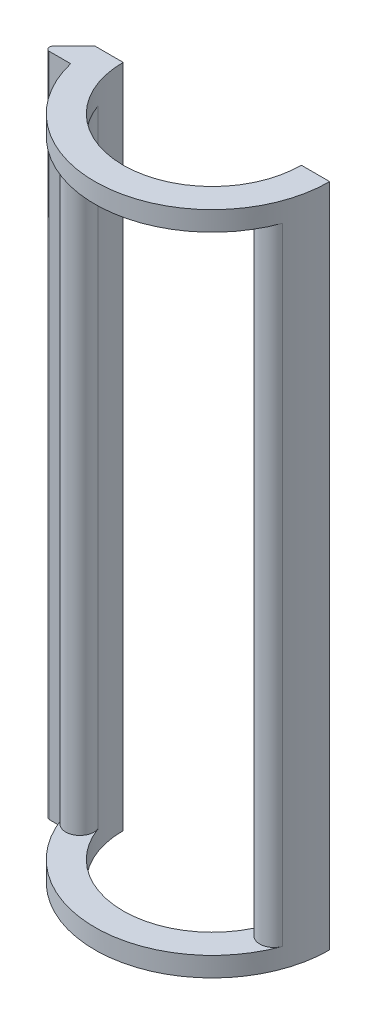
ISO-10303-21;
HEADER;
FILE_DESCRIPTION(('STEP AP214'),'2;1');
FILE_NAME('part.step','',(''),(''),'','','');
FILE_SCHEMA(('AUTOMOTIVE_DESIGN { 1 0 10303 214 1 1 1 1 }'));
ENDSEC;
DATA;
#1=APPLICATION_CONTEXT('core data for automotive mechanical design processes');
#2=APPLICATION_PROTOCOL_DEFINITION('international standard','automotive_design',2000,#1);
#3=PRODUCT_CONTEXT('',#1,'mechanical');
#4=PRODUCT('Part','Part','',(#3));
#5=PRODUCT_RELATED_PRODUCT_CATEGORY('part','',(#4));
#6=PRODUCT_DEFINITION_FORMATION('','',#4);
#7=PRODUCT_DEFINITION_CONTEXT('part definition',#1,'design');
#8=PRODUCT_DEFINITION('design','',#6,#7);
#9=PRODUCT_DEFINITION_SHAPE('','',#8);
#10=(LENGTH_UNIT() NAMED_UNIT(*) SI_UNIT(.MILLI.,.METRE.));
#11=(NAMED_UNIT(*) PLANE_ANGLE_UNIT() SI_UNIT($,.RADIAN.));
#12=(NAMED_UNIT(*) SI_UNIT($,.STERADIAN.) SOLID_ANGLE_UNIT());
#13=UNCERTAINTY_MEASURE_WITH_UNIT(LENGTH_MEASURE(1.E-05),#10,'distance_accuracy_value','');
#14=(GEOMETRIC_REPRESENTATION_CONTEXT(3) GLOBAL_UNCERTAINTY_ASSIGNED_CONTEXT((#13)) GLOBAL_UNIT_ASSIGNED_CONTEXT((#10,
#11,#12)) REPRESENTATION_CONTEXT('',''));
#15=CARTESIAN_POINT('',(0.,0.,0.));
#16=DIRECTION('',(0.,0.,1.));
#17=DIRECTION('',(1.,0.,0.));
#18=AXIS2_PLACEMENT_3D('',#15,#16,#17);
#19=CARTESIAN_POINT('',(0.,215.9,0.));
#20=DIRECTION('',(0.,-1.,0.));
#21=DIRECTION('',(0.,0.,-1.));
#22=AXIS2_PLACEMENT_3D('',#19,#20,#21);
#23=CYLINDRICAL_SURFACE('',#22,28.9052);
#24=DIRECTION('',(0.,-1.,0.));
#25=VECTOR('',#24,1.);
#26=CARTESIAN_POINT('',(27.1620031423408,209.55,9.88616064685723));
#27=LINE('',#26,#25);
#28=CARTESIAN_POINT('',(27.1620031423408,209.55,9.88616064685723));
#29=VERTEX_POINT('',#28);
#30=CARTESIAN_POINT('',(27.1620031423408,6.34999999999999,9.88616064685723));
#31=VERTEX_POINT('',#30);
#32=EDGE_CURVE('E54',#29,#31,#27,.T.);
#33=ORIENTED_EDGE('',*,*,#32,.F.);
#34=CARTESIAN_POINT('',(0.,209.55,0.));
#35=DIRECTION('',(0.,-1.,0.));
#36=DIRECTION('',(0.,0.,-1.));
#37=AXIS2_PLACEMENT_3D('',#34,#35,#36);
#38=CIRCLE('',#37,28.9052);
#39=CARTESIAN_POINT('',(-27.1620031423408,209.55,9.88616064685723));
#40=VERTEX_POINT('',#39);
#41=EDGE_CURVE('E344',#29,#40,#38,.T.);
#42=ORIENTED_EDGE('',*,*,#41,.T.);
#43=DIRECTION('',(0.,-1.,0.));
#44=VECTOR('',#43,1.);
#45=CARTESIAN_POINT('',(-27.1620031423408,209.55,9.88616064685723));
#46=LINE('',#45,#44);
#47=CARTESIAN_POINT('',(-27.1620031423408,6.35,9.88616064685723));
#48=VERTEX_POINT('',#47);
#49=EDGE_CURVE('E139',#40,#48,#46,.T.);
#50=ORIENTED_EDGE('',*,*,#49,.T.);
#51=CARTESIAN_POINT('',(0.,6.35,0.));
#52=DIRECTION('',(0.,-1.,0.));
#53=DIRECTION('',(0.,0.,-1.));
#54=AXIS2_PLACEMENT_3D('',#51,#52,#53);
#55=CIRCLE('',#54,28.9052);
#56=EDGE_CURVE('E140',#31,#48,#55,.T.);
#57=ORIENTED_EDGE('',*,*,#56,.F.);
#58=EDGE_LOOP('',(#33,#42,#50,#57));
#59=FACE_BOUND('',#58,.T.);
#60=CARTESIAN_POINT('',(0.,0.,0.));
#61=DIRECTION('',(0.,-1.,0.));
#62=DIRECTION('',(0.,0.,1.));
#63=AXIS2_PLACEMENT_3D('',#60,#61,#62);
#64=CIRCLE('',#63,28.9052);
#65=CARTESIAN_POINT('',(28.9052,0.,0.));
#66=VERTEX_POINT('',#65);
#67=CARTESIAN_POINT('',(-28.9052,0.,0.));
#68=VERTEX_POINT('',#67);
#69=EDGE_CURVE('E145',#66,#68,#64,.T.);
#70=ORIENTED_EDGE('',*,*,#69,.T.);
#71=DIRECTION('',(0.,-1.,0.));
#72=VECTOR('',#71,1.);
#73=CARTESIAN_POINT('',(-28.9052,215.9,0.));
#74=LINE('',#73,#72);
#75=CARTESIAN_POINT('',(-28.9052,215.9,0.));
#76=VERTEX_POINT('',#75);
#77=EDGE_CURVE('E190',#76,#68,#74,.T.);
#78=ORIENTED_EDGE('',*,*,#77,.F.);
#79=CARTESIAN_POINT('',(0.,215.9,0.));
#80=DIRECTION('',(0.,-1.,0.));
#81=DIRECTION('',(0.,0.,1.));
#82=AXIS2_PLACEMENT_3D('',#79,#80,#81);
#83=CIRCLE('',#82,28.9052);
#84=CARTESIAN_POINT('',(28.9052,215.9,0.));
#85=VERTEX_POINT('',#84);
#86=EDGE_CURVE('E154',#85,#76,#83,.T.);
#87=ORIENTED_EDGE('',*,*,#86,.F.);
#88=DIRECTION('',(0.,-1.,0.));
#89=VECTOR('',#88,1.);
#90=CARTESIAN_POINT('',(28.9052,215.9,0.));
#91=LINE('',#90,#89);
#92=EDGE_CURVE('E168',#85,#66,#91,.T.);
#93=ORIENTED_EDGE('',*,*,#92,.T.);
#94=EDGE_LOOP('',(#70,#78,#87,#93));
#95=FACE_BOUND('',#94,.T.);
#96=ADVANCED_FACE('F39',(#59,#95),#23,.F.);
#97=CARTESIAN_POINT('',(-28.9052,215.9,0.));
#98=DIRECTION('',(0.,0.,1.));
#99=DIRECTION('',(1.,0.,0.));
#100=AXIS2_PLACEMENT_3D('',#97,#98,#99);
#101=PLANE('',#100);
#102=DIRECTION('',(-1.,0.,0.));
#103=VECTOR('',#102,1.);
#104=CARTESIAN_POINT('',(-28.9052,0.,0.));
#105=LINE('',#104,#103);
#106=CARTESIAN_POINT('',(-38.1,0.,0.));
#107=VERTEX_POINT('',#106);
#108=EDGE_CURVE('E149',#68,#107,#105,.T.);
#109=ORIENTED_EDGE('',*,*,#108,.T.);
#110=DIRECTION('',(0.,-1.,0.));
#111=VECTOR('',#110,1.);
#112=CARTESIAN_POINT('',(-38.1,215.9,0.));
#113=LINE('',#112,#111);
#114=CARTESIAN_POINT('',(-38.1,215.9,0.));
#115=VERTEX_POINT('',#114);
#116=EDGE_CURVE('E187',#115,#107,#113,.T.);
#117=ORIENTED_EDGE('',*,*,#116,.F.);
#118=DIRECTION('',(-1.,0.,0.));
#119=VECTOR('',#118,1.);
#120=CARTESIAN_POINT('',(-28.9052,215.9,0.));
#121=LINE('',#120,#119);
#122=EDGE_CURVE('E157',#76,#115,#121,.T.);
#123=ORIENTED_EDGE('',*,*,#122,.F.);
#124=ORIENTED_EDGE('',*,*,#77,.T.);
#125=EDGE_LOOP('',(#109,#117,#123,#124));
#126=FACE_BOUND('',#125,.T.);
#127=ADVANCED_FACE('F228',(#126),#101,.F.);
#128=CARTESIAN_POINT('',(-46.99,215.9,8.89));
#129=DIRECTION('',(0.707106781186547,0.,0.707106781186548));
#130=DIRECTION('',(0.707106781186548,0.,-0.707106781186547));
#131=AXIS2_PLACEMENT_3D('',#128,#129,#130);
#132=PLANE('',#131);
#133=DIRECTION('',(-0.707106781186548,0.,0.707106781186547));
#134=VECTOR('',#133,1.);
#135=CARTESIAN_POINT('',(-46.99,0.,8.89));
#136=LINE('',#135,#134);
#137=CARTESIAN_POINT('',(-44.8219743878931,0.,6.72197438789308));
#138=VERTEX_POINT('',#137);
#139=EDGE_CURVE('E171',#107,#138,#136,.T.);
#140=ORIENTED_EDGE('',*,*,#139,.T.);
#141=DIRECTION('',(0.,-1.,0.));
#142=VECTOR('',#141,1.);
#143=CARTESIAN_POINT('',(-44.8219743878931,215.9,6.72197438789308));
#144=LINE('',#143,#142);
#145=CARTESIAN_POINT('',(-44.8219743878931,215.9,6.72197438789308));
#146=VERTEX_POINT('',#145);
#147=EDGE_CURVE('E47',#138,#146,#144,.F.);
#148=ORIENTED_EDGE('',*,*,#147,.T.);
#149=DIRECTION('',(-0.707106781186548,0.,0.707106781186547));
#150=VECTOR('',#149,1.);
#151=CARTESIAN_POINT('',(-46.99,215.9,8.89));
#152=LINE('',#151,#150);
#153=EDGE_CURVE('E160',#115,#146,#152,.T.);
#154=ORIENTED_EDGE('',*,*,#153,.F.);
#155=ORIENTED_EDGE('',*,*,#116,.T.);
#156=EDGE_LOOP('',(#140,#148,#154,#155));
#157=FACE_BOUND('',#156,.T.);
#158=ADVANCED_FACE('F200',(#157),#132,.F.);
#159=CARTESIAN_POINT('',(-38.1,215.9,8.89));
#160=DIRECTION('',(0.,0.,-1.));
#161=DIRECTION('',(-1.,0.,0.));
#162=AXIS2_PLACEMENT_3D('',#159,#160,#161);
#163=PLANE('',#162);
#164=DIRECTION('',(1.,0.,0.));
#165=VECTOR('',#164,1.);
#166=CARTESIAN_POINT('',(-38.1,215.9,8.89));
#167=LINE('',#166,#165);
#168=CARTESIAN_POINT('',(-43.9239487757862,215.9,8.89));
#169=VERTEX_POINT('',#168);
#170=CARTESIAN_POINT('',(-37.0483184503697,215.9,8.89));
#171=VERTEX_POINT('',#170);
#172=EDGE_CURVE('E163',#169,#171,#167,.T.);
#173=ORIENTED_EDGE('',*,*,#172,.F.);
#174=DIRECTION('',(0.,-1.,0.));
#175=VECTOR('',#174,1.);
#176=CARTESIAN_POINT('',(-43.9239487757862,215.9,8.89));
#177=LINE('',#176,#175);
#178=CARTESIAN_POINT('',(-43.9239487757862,0.,8.89));
#179=VERTEX_POINT('',#178);
#180=EDGE_CURVE('E193',#169,#179,#177,.T.);
#181=ORIENTED_EDGE('',*,*,#180,.T.);
#182=DIRECTION('',(1.,0.,0.));
#183=VECTOR('',#182,1.);
#184=CARTESIAN_POINT('',(-38.1,0.,8.89));
#185=LINE('',#184,#183);
#186=CARTESIAN_POINT('',(-37.0483184503697,0.,8.89));
#187=VERTEX_POINT('',#186);
#188=EDGE_CURVE('E174',#179,#187,#185,.T.);
#189=ORIENTED_EDGE('',*,*,#188,.T.);
#190=DIRECTION('',(0.,-1.,0.));
#191=VECTOR('',#190,1.);
#192=CARTESIAN_POINT('',(-37.0483184503697,215.9,8.89));
#193=LINE('',#192,#191);
#194=EDGE_CURVE('E184',#171,#187,#193,.T.);
#195=ORIENTED_EDGE('',*,*,#194,.F.);
#196=EDGE_LOOP('',(#173,#181,#189,#195));
#197=FACE_BOUND('',#196,.T.);
#198=ADVANCED_FACE('F211',(#197),#163,.F.);
#199=CARTESIAN_POINT('',(0.,215.9,0.));
#200=DIRECTION('',(0.,-1.,0.));
#201=DIRECTION('',(0.,0.,-1.));
#202=AXIS2_PLACEMENT_3D('',#199,#200,#201);
#203=CYLINDRICAL_SURFACE('',#202,38.1);
#204=DIRECTION('',(0.,-1.,0.));
#205=VECTOR('',#204,1.);
#206=CARTESIAN_POINT('',(-35.8022888519431,209.55,13.0309674607081));
#207=LINE('',#206,#205);
#208=CARTESIAN_POINT('',(-35.8022888519431,209.55,13.0309674607081));
#209=VERTEX_POINT('',#208);
#210=CARTESIAN_POINT('',(-35.8022888519431,6.35,13.0309674607081));
#211=VERTEX_POINT('',#210);
#212=EDGE_CURVE('E136',#209,#211,#207,.T.);
#213=ORIENTED_EDGE('',*,*,#212,.F.);
#214=CARTESIAN_POINT('',(0.,209.55,0.));
#215=DIRECTION('',(0.,1.,0.));
#216=DIRECTION('',(0.,0.,1.));
#217=AXIS2_PLACEMENT_3D('',#214,#215,#216);
#218=CIRCLE('',#217,38.1);
#219=CARTESIAN_POINT('',(35.8022888519431,209.55,13.0309674607081));
#220=VERTEX_POINT('',#219);
#221=EDGE_CURVE('E123',#209,#220,#218,.T.);
#222=ORIENTED_EDGE('',*,*,#221,.T.);
#223=DIRECTION('',(0.,-1.,0.));
#224=VECTOR('',#223,1.);
#225=CARTESIAN_POINT('',(35.8022888519431,209.55,13.0309674607081));
#226=LINE('',#225,#224);
#227=CARTESIAN_POINT('',(35.8022888519431,6.35,13.0309674607081));
#228=VERTEX_POINT('',#227);
#229=EDGE_CURVE('E146',#220,#228,#226,.T.);
#230=ORIENTED_EDGE('',*,*,#229,.T.);
#231=CARTESIAN_POINT('',(0.,6.35,0.));
#232=DIRECTION('',(0.,1.,0.));
#233=DIRECTION('',(0.,0.,1.));
#234=AXIS2_PLACEMENT_3D('',#231,#232,#233);
#235=CIRCLE('',#234,38.1);
#236=EDGE_CURVE('E144',#211,#228,#235,.T.);
#237=ORIENTED_EDGE('',*,*,#236,.F.);
#238=EDGE_LOOP('',(#213,#222,#230,#237));
#239=FACE_BOUND('',#238,.T.);
#240=CARTESIAN_POINT('',(0.,0.,0.));
#241=DIRECTION('',(0.,1.,0.));
#242=DIRECTION('',(0.,0.,-1.));
#243=AXIS2_PLACEMENT_3D('',#240,#241,#242);
#244=CIRCLE('',#243,38.1);
#245=CARTESIAN_POINT('',(38.1,0.,0.));
#246=VERTEX_POINT('',#245);
#247=EDGE_CURVE('E176',#187,#246,#244,.T.);
#248=ORIENTED_EDGE('',*,*,#247,.T.);
#249=DIRECTION('',(0.,-1.,0.));
#250=VECTOR('',#249,1.);
#251=CARTESIAN_POINT('',(38.1,215.9,0.));
#252=LINE('',#251,#250);
#253=CARTESIAN_POINT('',(38.1,215.9,0.));
#254=VERTEX_POINT('',#253);
#255=EDGE_CURVE('E181',#254,#246,#252,.T.);
#256=ORIENTED_EDGE('',*,*,#255,.F.);
#257=CARTESIAN_POINT('',(0.,215.9,0.));
#258=DIRECTION('',(0.,1.,0.));
#259=DIRECTION('',(0.,0.,-1.));
#260=AXIS2_PLACEMENT_3D('',#257,#258,#259);
#261=CIRCLE('',#260,38.1);
#262=EDGE_CURVE('E165',#171,#254,#261,.T.);
#263=ORIENTED_EDGE('',*,*,#262,.F.);
#264=ORIENTED_EDGE('',*,*,#194,.T.);
#265=EDGE_LOOP('',(#248,#256,#263,#264));
#266=FACE_BOUND('',#265,.T.);
#267=ADVANCED_FACE('F142',(#239,#266),#203,.T.);
#268=CARTESIAN_POINT('',(28.9052,215.9,0.));
#269=DIRECTION('',(0.,0.,1.));
#270=DIRECTION('',(1.,0.,0.));
#271=AXIS2_PLACEMENT_3D('',#268,#269,#270);
#272=PLANE('',#271);
#273=DIRECTION('',(-1.,0.,0.));
#274=VECTOR('',#273,1.);
#275=CARTESIAN_POINT('',(28.9052,0.,0.));
#276=LINE('',#275,#274);
#277=EDGE_CURVE('E158',#246,#66,#276,.T.);
#278=ORIENTED_EDGE('',*,*,#277,.T.);
#279=ORIENTED_EDGE('',*,*,#92,.F.);
#280=DIRECTION('',(-1.,0.,0.));
#281=VECTOR('',#280,1.);
#282=CARTESIAN_POINT('',(28.9052,215.9,0.));
#283=LINE('',#282,#281);
#284=EDGE_CURVE('E167',#254,#85,#283,.T.);
#285=ORIENTED_EDGE('',*,*,#284,.F.);
#286=ORIENTED_EDGE('',*,*,#255,.T.);
#287=EDGE_LOOP('',(#278,#279,#285,#286));
#288=FACE_BOUND('',#287,.T.);
#289=ADVANCED_FACE('F222',(#288),#272,.F.);
#290=CARTESIAN_POINT('',(0.,215.9,0.));
#291=DIRECTION('',(0.,1.,0.));
#292=DIRECTION('',(0.,0.,1.));
#293=AXIS2_PLACEMENT_3D('',#290,#291,#292);
#294=PLANE('',#293);
#295=ORIENTED_EDGE('',*,*,#153,.T.);
#296=CARTESIAN_POINT('',(-43.9239487757862,215.9,7.62));
#297=DIRECTION('',(0.,1.,0.));
#298=DIRECTION('',(0.,0.,1.));
#299=AXIS2_PLACEMENT_3D('',#296,#297,#298);
#300=CIRCLE('',#299,1.27);
#301=EDGE_CURVE('E11',#146,#169,#300,.T.);
#302=ORIENTED_EDGE('',*,*,#301,.T.);
#303=ORIENTED_EDGE('',*,*,#172,.T.);
#304=ORIENTED_EDGE('',*,*,#262,.T.);
#305=ORIENTED_EDGE('',*,*,#284,.T.);
#306=ORIENTED_EDGE('',*,*,#86,.T.);
#307=ORIENTED_EDGE('',*,*,#122,.T.);
#308=EDGE_LOOP('',(#295,#302,#303,#304,#305,#306,#307));
#309=FACE_BOUND('',#308,.T.);
#310=ADVANCED_FACE('F205',(#309),#294,.T.);
#311=CARTESIAN_POINT('',(0.,0.,0.));
#312=DIRECTION('',(0.,1.,0.));
#313=DIRECTION('',(0.,0.,1.));
#314=AXIS2_PLACEMENT_3D('',#311,#312,#313);
#315=PLANE('',#314);
#316=ORIENTED_EDGE('',*,*,#188,.F.);
#317=CARTESIAN_POINT('',(-43.9239487757862,0.,7.62));
#318=DIRECTION('',(0.,1.,0.));
#319=DIRECTION('',(0.,0.,1.));
#320=AXIS2_PLACEMENT_3D('',#317,#318,#319);
#321=CIRCLE('',#320,1.27);
#322=EDGE_CURVE('E196',#179,#138,#321,.F.);
#323=ORIENTED_EDGE('',*,*,#322,.T.);
#324=ORIENTED_EDGE('',*,*,#139,.F.);
#325=ORIENTED_EDGE('',*,*,#108,.F.);
#326=ORIENTED_EDGE('',*,*,#69,.F.);
#327=ORIENTED_EDGE('',*,*,#277,.F.);
#328=ORIENTED_EDGE('',*,*,#247,.F.);
#329=EDGE_LOOP('',(#316,#323,#324,#325,#326,#327,#328));
#330=FACE_BOUND('',#329,.T.);
#331=ADVANCED_FACE('F215',(#330),#315,.F.);
#332=CARTESIAN_POINT('',(-43.9239487757862,215.9,7.62));
#333=DIRECTION('',(0.,-1.,0.));
#334=DIRECTION('',(0.,0.,-1.));
#335=AXIS2_PLACEMENT_3D('',#332,#333,#334);
#336=CYLINDRICAL_SURFACE('',#335,1.27);
#337=ORIENTED_EDGE('',*,*,#301,.F.);
#338=ORIENTED_EDGE('',*,*,#147,.F.);
#339=ORIENTED_EDGE('',*,*,#322,.F.);
#340=ORIENTED_EDGE('',*,*,#180,.F.);
#341=EDGE_LOOP('',(#337,#338,#339,#340));
#342=FACE_BOUND('',#341,.T.);
#343=ADVANCED_FACE('F41',(#342),#336,.T.);
#344=CARTESIAN_POINT('',(-31.4821459971419,209.55,11.4585640537827));
#345=DIRECTION('',(0.,-1.,0.));
#346=DIRECTION('',(0.,0.,-1.));
#347=AXIS2_PLACEMENT_3D('',#344,#345,#346);
#348=CYLINDRICAL_SURFACE('',#347,4.5974);
#349=CARTESIAN_POINT('',(-31.4821459971419,6.35,11.4585640537827));
#350=DIRECTION('',(0.,-1.,0.));
#351=DIRECTION('',(0.,0.,1.));
#352=AXIS2_PLACEMENT_3D('',#349,#350,#351);
#353=CIRCLE('',#352,4.5974);
#354=EDGE_CURVE('E62',#48,#211,#353,.T.);
#355=ORIENTED_EDGE('',*,*,#354,.F.);
#356=ORIENTED_EDGE('',*,*,#49,.F.);
#357=CARTESIAN_POINT('',(-31.4821459971419,209.55,11.4585640537827));
#358=DIRECTION('',(0.,-1.,0.));
#359=DIRECTION('',(0.,0.,1.));
#360=AXIS2_PLACEMENT_3D('',#357,#358,#359);
#361=CIRCLE('',#360,4.5974);
#362=EDGE_CURVE('E127',#40,#209,#361,.T.);
#363=ORIENTED_EDGE('',*,*,#362,.T.);
#364=ORIENTED_EDGE('',*,*,#212,.T.);
#365=EDGE_LOOP('',(#355,#356,#363,#364));
#366=FACE_BOUND('',#365,.T.);
#367=ADVANCED_FACE('F135',(#366),#348,.T.);
#368=CARTESIAN_POINT('',(31.4821459971419,209.55,11.4585640537827));
#369=DIRECTION('',(0.,-1.,0.));
#370=DIRECTION('',(0.,0.,-1.));
#371=AXIS2_PLACEMENT_3D('',#368,#369,#370);
#372=CYLINDRICAL_SURFACE('',#371,4.59740000000001);
#373=CARTESIAN_POINT('',(31.4821459971419,6.35,11.4585640537827));
#374=DIRECTION('',(0.,-1.,0.));
#375=DIRECTION('',(0.,0.,-1.));
#376=AXIS2_PLACEMENT_3D('',#373,#374,#375);
#377=CIRCLE('',#376,4.59740000000001);
#378=EDGE_CURVE('E337',#228,#31,#377,.T.);
#379=ORIENTED_EDGE('',*,*,#378,.F.);
#380=ORIENTED_EDGE('',*,*,#229,.F.);
#381=CARTESIAN_POINT('',(31.4821459971419,209.55,11.4585640537827));
#382=DIRECTION('',(0.,-1.,0.));
#383=DIRECTION('',(0.,0.,-1.));
#384=AXIS2_PLACEMENT_3D('',#381,#382,#383);
#385=CIRCLE('',#384,4.59740000000001);
#386=EDGE_CURVE('E129',#220,#29,#385,.T.);
#387=ORIENTED_EDGE('',*,*,#386,.T.);
#388=ORIENTED_EDGE('',*,*,#32,.T.);
#389=EDGE_LOOP('',(#379,#380,#387,#388));
#390=FACE_BOUND('',#389,.T.);
#391=ADVANCED_FACE('F250',(#390),#372,.T.);
#392=CARTESIAN_POINT('',(-15.741072998571,209.55,5.72928202689134));
#393=DIRECTION('',(0.,1.,0.));
#394=DIRECTION('',(0.,0.,1.));
#395=AXIS2_PLACEMENT_3D('',#392,#393,#394);
#396=PLANE('',#395);
#397=ORIENTED_EDGE('',*,*,#362,.F.);
#398=ORIENTED_EDGE('',*,*,#41,.F.);
#399=ORIENTED_EDGE('',*,*,#386,.F.);
#400=ORIENTED_EDGE('',*,*,#221,.F.);
#401=EDGE_LOOP('',(#397,#398,#399,#400));
#402=FACE_BOUND('',#401,.T.);
#403=ADVANCED_FACE('F125',(#402),#396,.F.);
#404=CARTESIAN_POINT('',(-15.741072998571,6.35,5.72928202689134));
#405=DIRECTION('',(0.,1.,0.));
#406=DIRECTION('',(0.,0.,1.));
#407=AXIS2_PLACEMENT_3D('',#404,#405,#406);
#408=PLANE('',#407);
#409=ORIENTED_EDGE('',*,*,#354,.T.);
#410=ORIENTED_EDGE('',*,*,#236,.T.);
#411=ORIENTED_EDGE('',*,*,#378,.T.);
#412=ORIENTED_EDGE('',*,*,#56,.T.);
#413=EDGE_LOOP('',(#409,#410,#411,#412));
#414=FACE_BOUND('',#413,.T.);
#415=ADVANCED_FACE('F253',(#414),#408,.T.);
#416=CLOSED_SHELL('',(#96,#127,#158,#198,#267,#289,#310,#331,#343,#367,#391,#403,#415));
#417=MANIFOLD_SOLID_BREP('B2',#416);
#418=ADVANCED_BREP_SHAPE_REPRESENTATION('',(#18,#417),#14);
#419=SHAPE_DEFINITION_REPRESENTATION(#9,#418);
ENDSEC;
END-ISO-10303-21;
